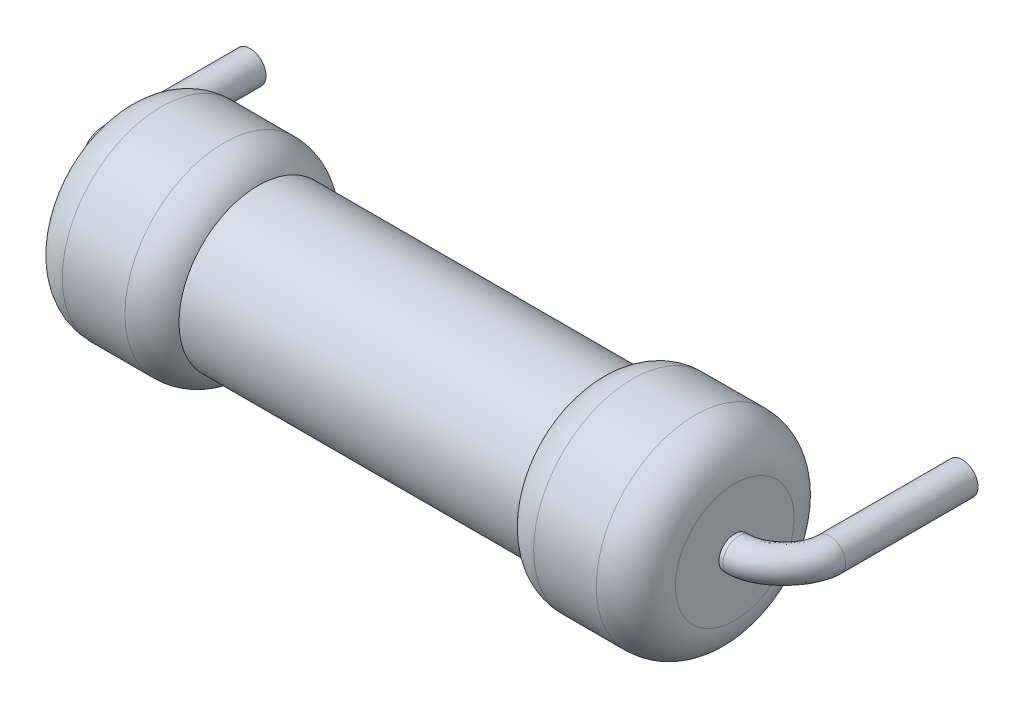
ISO-10303-21;
HEADER;
FILE_DESCRIPTION(('STEP AP214'),'2;1');
FILE_NAME('part.step','',(''),(''),'','','');
FILE_SCHEMA(('AUTOMOTIVE_DESIGN { 1 0 10303 214 1 1 1 1 }'));
ENDSEC;
DATA;
#1=APPLICATION_CONTEXT('core data for automotive mechanical design processes');
#2=APPLICATION_PROTOCOL_DEFINITION('international standard','automotive_design',2000,#1);
#3=PRODUCT_CONTEXT('',#1,'mechanical');
#4=PRODUCT('Part','Part','',(#3));
#5=PRODUCT_RELATED_PRODUCT_CATEGORY('part','',(#4));
#6=PRODUCT_DEFINITION_FORMATION('','',#4);
#7=PRODUCT_DEFINITION_CONTEXT('part definition',#1,'design');
#8=PRODUCT_DEFINITION('design','',#6,#7);
#9=PRODUCT_DEFINITION_SHAPE('','',#8);
#10=(LENGTH_UNIT() NAMED_UNIT(*) SI_UNIT(.MILLI.,.METRE.));
#11=(NAMED_UNIT(*) PLANE_ANGLE_UNIT() SI_UNIT($,.RADIAN.));
#12=(NAMED_UNIT(*) SI_UNIT($,.STERADIAN.) SOLID_ANGLE_UNIT());
#13=UNCERTAINTY_MEASURE_WITH_UNIT(LENGTH_MEASURE(1.E-05),#10,'distance_accuracy_value','');
#14=(GEOMETRIC_REPRESENTATION_CONTEXT(3) GLOBAL_UNCERTAINTY_ASSIGNED_CONTEXT((#13)) GLOBAL_UNIT_ASSIGNED_CONTEXT((#10,
#11,#12)) REPRESENTATION_CONTEXT('',''));
#15=CARTESIAN_POINT('',(0.,0.,0.));
#16=DIRECTION('',(0.,0.,1.));
#17=DIRECTION('',(1.,0.,0.));
#18=AXIS2_PLACEMENT_3D('',#15,#16,#17);
#19=CARTESIAN_POINT('',(-7.85,0.,2.));
#20=DIRECTION('',(1.,0.,0.));
#21=DIRECTION('',(0.,0.,1.));
#22=AXIS2_PLACEMENT_3D('',#19,#20,#21);
#23=CYLINDRICAL_SURFACE('',#22,0.4);
#24=CARTESIAN_POINT('',(-7.85,-0.323459007335841,2.23531738264164));
#25=CARTESIAN_POINT('',(-7.85,-0.316965247557054,2.24424347670382));
#26=CARTESIAN_POINT('',(-7.85,-0.303375207411567,2.26140053011708));
#27=CARTESIAN_POINT('',(-7.85,-0.281326856591722,2.28502794870943));
#28=CARTESIAN_POINT('',(-7.85,-0.257759486332386,2.30652444837994));
#29=CARTESIAN_POINT('',(-7.85,-0.108106775112152,2.42258138850631));
#30=CARTESIAN_POINT('',(-7.85,0.0924998776468602,2.42735916379643));
#31=CARTESIAN_POINT('',(-7.85,0.413839263885118,2.1935838117601));
#32=CARTESIAN_POINT('',(-7.85,0.45333420291158,1.94320449860183));
#33=CARTESIAN_POINT('',(-7.85,0.193583811760101,1.58616073611488));
#34=CARTESIAN_POINT('',(-7.85,-0.056795501398165,1.54666579708842));
#35=CARTESIAN_POINT('',(-7.85,-0.378134887636423,1.78044114912475));
#36=CARTESIAN_POINT('',(-7.85,-0.435340165985808,1.97277786532025));
#37=CARTESIAN_POINT('',(-7.85,-0.370984816172936,2.15088888765611));
#38=CARTESIAN_POINT('',(-7.85,-0.357786644701291,2.17992901005306));
#39=CARTESIAN_POINT('',(-7.85,-0.342093435999191,2.20817981329555));
#40=CARTESIAN_POINT('',(-7.85,-0.329952767114628,2.22639128857947));
#41=CARTESIAN_POINT('',(-7.85,-0.323459007335841,2.23531738264164));
#42=B_SPLINE_CURVE_WITH_KNOTS('',3,(#24,#25,#26,#27,#28,#29,#30,#31,#32,#33,#34,#35,#36,#37,#38,
#39,#40,#41),.UNSPECIFIED.,.T.,.F.,(4,1,1,1,1,2,2,2,1,1,1,1,4),(0.,0.0125,0.0249999999999999,
0.0375000000000001,0.05,0.25,0.5,0.75,0.95,0.9625,0.975,0.9875,1.),.UNSPECIFIED.);
#43=CARTESIAN_POINT('',(-7.85,-0.323459007335841,2.23531738264164));
#44=VERTEX_POINT('',#43);
#45=EDGE_CURVE('E12',#44,#44,#42,.F.);
#46=ORIENTED_EDGE('',*,*,#45,.T.);
#47=EDGE_LOOP('',(#46));
#48=FACE_BOUND('',#47,.T.);
#49=CARTESIAN_POINT('',(-7.75,0.,2.));
#50=DIRECTION('',(1.,0.,0.));
#51=DIRECTION('',(0.,0.,-1.));
#52=AXIS2_PLACEMENT_3D('',#49,#50,#51);
#53=CIRCLE('',#52,0.4);
#54=CARTESIAN_POINT('',(-7.75,0.,1.6));
#55=VERTEX_POINT('',#54);
#56=EDGE_CURVE('E93',#55,#55,#53,.T.);
#57=ORIENTED_EDGE('',*,*,#56,.F.);
#58=EDGE_LOOP('',(#57));
#59=FACE_BOUND('',#58,.T.);
#60=ADVANCED_FACE('F84',(#48,#59),#23,.T.);
#61=CARTESIAN_POINT('',(-7.75,0.,2.));
#62=DIRECTION('',(-1.,0.,0.));
#63=DIRECTION('',(0.,0.,-1.));
#64=AXIS2_PLACEMENT_3D('',#61,#62,#63);
#65=PLANE('',#64);
#66=ORIENTED_EDGE('',*,*,#56,.T.);
#67=EDGE_LOOP('',(#66));
#68=FACE_BOUND('',#67,.T.);
#69=ADVANCED_FACE('F122',(#68),#65,.F.);
#70=CARTESIAN_POINT('',(-9.13217940086859,-0.377529609416294,0.85));
#71=CARTESIAN_POINT('',(-9.13217940086859,-0.377529609416294,1.47946290126938));
#72=CARTESIAN_POINT('',(-8.47946290126938,-0.323459007335841,2.23531738264164));
#73=CARTESIAN_POINT('',(-7.85,-0.323459007335841,2.23531738264164));
#74=CARTESIAN_POINT('',(-9.14259761377495,-0.373882019649194,0.85));
#75=CARTESIAN_POINT('',(-9.14259761377495,-0.373882019649194,1.48400592966714));
#76=CARTESIAN_POINT('',(-8.48400592966714,-0.316965247557054,2.24424347670382));
#77=CARTESIAN_POINT('',(-7.85,-0.316965247557054,2.24424347670382));
#78=CARTESIAN_POINT('',(-9.16294190702586,-0.365809634307624,0.85));
#79=CARTESIAN_POINT('',(-9.16294190702586,-0.365809634307624,1.49289917218409));
#80=CARTESIAN_POINT('',(-8.49289917218409,-0.303375207411567,2.26140053011708));
#81=CARTESIAN_POINT('',(-7.85,-0.303375207411567,2.26140053011708));
#82=CARTESIAN_POINT('',(-9.19191860194518,-0.351501041268287,0.85));
#83=CARTESIAN_POINT('',(-9.19191860194518,-0.351501041268287,1.50531353197619));
#84=CARTESIAN_POINT('',(-8.50531353197618,-0.281326856591722,2.28502794870943));
#85=CARTESIAN_POINT('',(-7.85,-0.281326856591722,2.28502794870943));
#86=CARTESIAN_POINT('',(-9.21929220463593,-0.335124035597089,0.85));
#87=CARTESIAN_POINT('',(-9.21929220463593,-0.335124035597089,1.51686495799785));
#88=CARTESIAN_POINT('',(-8.51686495799784,-0.257759486332386,2.30652444837994));
#89=CARTESIAN_POINT('',(-7.85,-0.257759486332386,2.30652444837994));
#90=CARTESIAN_POINT('',(-9.37353518377958,-0.225241140149463,0.85));
#91=CARTESIAN_POINT('',(-9.37353518377958,-0.225241140149463,1.58080304852248));
#92=CARTESIAN_POINT('',(-8.58080304852247,-0.108106775112152,2.42258138850631));
#93=CARTESIAN_POINT('',(-7.85,-0.108106775112152,2.42258138850631));
#94=CARTESIAN_POINT('',(-9.43589104568991,-0.0345120056332151,0.85));
#95=CARTESIAN_POINT('',(-9.43589104568991,-0.0345120056332151,1.5950973445798));
#96=CARTESIAN_POINT('',(-8.59509734457979,0.0924998776468602,2.42735916379643));
#97=CARTESIAN_POINT('',(-7.85,0.0924998776468602,2.42735916379643));
#98=CARTESIAN_POINT('',(-9.30457781407428,0.34054365899585,0.85));
#99=CARTESIAN_POINT('',(-9.30457781407428,0.34054365899585,1.51227959808129));
#100=CARTESIAN_POINT('',(-8.51227959808129,0.413839263885118,2.1935838117601));
#101=CARTESIAN_POINT('',(-7.85,0.413839263885118,2.1935838117601));
#102=CARTESIAN_POINT('',(-9.07618485725867,0.450481404758313,0.85));
#103=CARTESIAN_POINT('',(-9.07618485725867,0.450481404758313,1.38773639134445));
#104=CARTESIAN_POINT('',(-8.38773639134445,0.45333420291158,1.94320449860183));
#105=CARTESIAN_POINT('',(-7.85,0.45333420291158,1.94320449860183));
#106=CARTESIAN_POINT('',(-8.65945634100415,0.304577814074276,0.85));
#107=CARTESIAN_POINT('',(-8.65945634100415,0.304577814074276,1.22526274277296));
#108=CARTESIAN_POINT('',(-8.22526274277297,0.193583811760101,1.58616073611488));
#109=CARTESIAN_POINT('',(-7.85,0.193583811760101,1.58616073611488));
#110=CARTESIAN_POINT('',(-8.54951859524169,0.0761848572586665,0.85));
#111=CARTESIAN_POINT('',(-8.54951859524169,0.0761848572586665,1.1873323009383));
#112=CARTESIAN_POINT('',(-8.18733230093831,-0.056795501398165,1.54666579708842));
#113=CARTESIAN_POINT('',(-7.85,-0.056795501398165,1.54666579708842));
#114=CARTESIAN_POINT('',(-8.68083182685732,-0.298870807370398,0.85));
#115=CARTESIAN_POINT('',(-8.68083182685732,-0.298870807370398,1.26173995856457));
#116=CARTESIAN_POINT('',(-8.26173995856458,-0.378134887636423,1.78044114912475));
#117=CARTESIAN_POINT('',(-7.85,-0.378134887636423,1.78044114912475));
#118=CARTESIAN_POINT('',(-8.84854084270008,-0.409050398370507,0.85));
#119=CARTESIAN_POINT('',(-8.84854084270008,-0.409050398370507,1.35077916799447));
#120=CARTESIAN_POINT('',(-8.35077916799447,-0.435340165985808,1.97277786532025));
#121=CARTESIAN_POINT('',(-7.85,-0.435340165985808,1.97277786532025));
#122=CARTESIAN_POINT('',(-9.03764002887707,-0.39872348623463,0.85));
#123=CARTESIAN_POINT('',(-9.03764002887707,-0.39872348623463,1.43722411128089));
#124=CARTESIAN_POINT('',(-8.43722411128089,-0.370984816172936,2.15088888765611));
#125=CARTESIAN_POINT('',(-7.85,-0.370984816172936,2.15088888765611));
#126=CARTESIAN_POINT('',(-9.0692509366116,-0.394449032910081,0.85));
#127=CARTESIAN_POINT('',(-9.0692509366116,-0.394449032910081,1.45153945578255));
#128=CARTESIAN_POINT('',(-8.45153945578254,-0.357786644701291,2.17992901005306));
#129=CARTESIAN_POINT('',(-7.85,-0.357786644701291,2.17992901005306));
#130=CARTESIAN_POINT('',(-9.10082461865606,-0.387557931012075,0.85));
#131=CARTESIAN_POINT('',(-9.10082461865606,-0.387557931012075,1.4656410017975));
#132=CARTESIAN_POINT('',(-8.4656410017975,-0.342093435999191,2.20817981329555));
#133=CARTESIAN_POINT('',(-7.85,-0.342093435999191,2.20817981329555));
#134=CARTESIAN_POINT('',(-9.12176118796223,-0.381177199183395,0.85));
#135=CARTESIAN_POINT('',(-9.12176118796223,-0.381177199183395,1.47491987287161));
#136=CARTESIAN_POINT('',(-8.47491987287161,-0.329952767114628,2.22639128857947));
#137=CARTESIAN_POINT('',(-7.85,-0.329952767114628,2.22639128857947));
#138=CARTESIAN_POINT('',(-9.13217940086859,-0.377529609416294,0.85));
#139=CARTESIAN_POINT('',(-9.13217940086859,-0.377529609416294,1.47946290126938));
#140=CARTESIAN_POINT('',(-8.47946290126938,-0.323459007335841,2.23531738264164));
#141=CARTESIAN_POINT('',(-7.85,-0.323459007335841,2.23531738264164));
#142=B_SPLINE_SURFACE_WITH_KNOTS('',3,3,((#70,#71,#72,#73),(#74,#75,#76,#77),(#78,#79,#80,#81),
(#82,#83,#84,#85),(#86,#87,#88,#89),(#90,#91,#92,#93),(#94,#95,#96,#97),(#98,#99,#100,#101),
(#102,#103,#104,#105),(#106,#107,#108,#109),(#110,#111,#112,#113),(#114,#115,#116,#117),(#118,
#119,#120,#121),(#122,#123,#124,#125),(#126,#127,#128,#129),(#130,#131,#132,#133),(#134,#135,
#136,#137),(#138,#139,#140,#141)),.UNSPECIFIED.,.T.,.F.,.F.,(4,1,1,1,1,2,2,2,1,1,1,1,4),(4,4),
(0.,0.0125,0.0249999999999999,0.0375000000000001,0.05,0.25,0.5,0.75,0.95,0.9625,0.975,0.9875,
1.),(0.,1.),.UNSPECIFIED.);
#143=CARTESIAN_POINT('',(-9.13217940086859,-0.377529609416294,0.85));
#144=CARTESIAN_POINT('',(-9.12176118796223,-0.381177199183395,0.85));
#145=CARTESIAN_POINT('',(-9.10082461865606,-0.387557931012075,0.85));
#146=CARTESIAN_POINT('',(-9.0692509366116,-0.394449032910081,0.85));
#147=CARTESIAN_POINT('',(-9.03764002887707,-0.39872348623463,0.85));
#148=CARTESIAN_POINT('',(-8.84854084270008,-0.409050398370507,0.85));
#149=CARTESIAN_POINT('',(-8.68083182685732,-0.298870807370398,0.85));
#150=CARTESIAN_POINT('',(-8.54951859524169,0.0761848572586665,0.85));
#151=CARTESIAN_POINT('',(-8.65945634100415,0.304577814074276,0.85));
#152=CARTESIAN_POINT('',(-9.07618485725867,0.450481404758313,0.85));
#153=CARTESIAN_POINT('',(-9.30457781407428,0.34054365899585,0.85));
#154=CARTESIAN_POINT('',(-9.43589104568991,-0.0345120056332151,0.85));
#155=CARTESIAN_POINT('',(-9.37353518377958,-0.225241140149463,0.85));
#156=CARTESIAN_POINT('',(-9.21929220463593,-0.335124035597089,0.85));
#157=CARTESIAN_POINT('',(-9.19191860194518,-0.351501041268287,0.85));
#158=CARTESIAN_POINT('',(-9.16294190702586,-0.365809634307624,0.85));
#159=CARTESIAN_POINT('',(-9.14259761377495,-0.373882019649194,0.85));
#160=CARTESIAN_POINT('',(-9.13217940086859,-0.377529609416294,0.85));
#161=B_SPLINE_CURVE_WITH_KNOTS('',3,(#143,#144,#145,#146,#147,#148,#149,#150,#151,#152,#153,
#154,#155,#156,#157,#158,#159,#160),.UNSPECIFIED.,.T.,.F.,(4,1,1,1,1,2,2,2,1,1,1,1,4),(0.,
0.0125,0.025,0.0375,0.05,0.25,0.5,0.75,0.95,0.9625,0.975,0.9875,1.),.UNSPECIFIED.);
#162=CARTESIAN_POINT('',(-9.13217940086859,-0.377529609416294,0.85));
#163=VERTEX_POINT('',#162);
#164=EDGE_CURVE('E102',#163,#163,#161,.F.);
#165=ORIENTED_EDGE('',*,*,#164,.F.);
#166=EDGE_LOOP('',(#165));
#167=FACE_BOUND('',#166,.T.);
#168=ORIENTED_EDGE('',*,*,#45,.F.);
#169=EDGE_LOOP('',(#168));
#170=FACE_BOUND('',#169,.T.);
#171=ADVANCED_FACE('F110',(#167,#170),#142,.F.);
#172=CARTESIAN_POINT('',(-9.,0.,-2.5));
#173=DIRECTION('',(0.,0.,1.));
#174=DIRECTION('',(-1.,0.,0.));
#175=AXIS2_PLACEMENT_3D('',#172,#173,#174);
#176=CYLINDRICAL_SURFACE('',#175,0.4);
#177=CARTESIAN_POINT('',(-9.,0.,-2.5));
#178=DIRECTION('',(0.,0.,-1.));
#179=DIRECTION('',(-1.,0.,0.));
#180=AXIS2_PLACEMENT_3D('',#177,#178,#179);
#181=CIRCLE('',#180,0.4);
#182=CARTESIAN_POINT('',(-9.4,0.,-2.5));
#183=VERTEX_POINT('',#182);
#184=EDGE_CURVE('E97',#183,#183,#181,.T.);
#185=ORIENTED_EDGE('',*,*,#184,.F.);
#186=EDGE_LOOP('',(#185));
#187=FACE_BOUND('',#186,.T.);
#188=ORIENTED_EDGE('',*,*,#164,.T.);
#189=EDGE_LOOP('',(#188));
#190=FACE_BOUND('',#189,.T.);
#191=ADVANCED_FACE('F121',(#187,#190),#176,.T.);
#192=CARTESIAN_POINT('',(-9.,0.,-2.5));
#193=DIRECTION('',(0.,0.,1.));
#194=DIRECTION('',(-1.,0.,0.));
#195=AXIS2_PLACEMENT_3D('',#192,#193,#194);
#196=PLANE('',#195);
#197=ORIENTED_EDGE('',*,*,#184,.T.);
#198=EDGE_LOOP('',(#197));
#199=FACE_BOUND('',#198,.T.);
#200=ADVANCED_FACE('F153',(#199),#196,.F.);
#201=CLOSED_SHELL('',(#60,#69,#171,#191,#200));
#202=MANIFOLD_SOLID_BREP('B2',#201);
#203=CARTESIAN_POINT('',(4.3,0.,2.));
#204=DIRECTION('',(-1.,0.,0.));
#205=DIRECTION('',(0.,0.,1.));
#206=AXIS2_PLACEMENT_3D('',#203,#204,#205);
#207=CYLINDRICAL_SURFACE('',#206,2.);
#208=CARTESIAN_POINT('',(4.3,0.,2.));
#209=DIRECTION('',(1.,0.,0.));
#210=DIRECTION('',(0.,0.,-1.));
#211=AXIS2_PLACEMENT_3D('',#208,#209,#210);
#212=CIRCLE('',#211,2.);
#213=CARTESIAN_POINT('',(4.3,0.,4.));
#214=VERTEX_POINT('',#213);
#215=EDGE_CURVE('E232',#214,#214,#212,.T.);
#216=CARTESIAN_POINT('',(-4.3,0.,2.));
#217=DIRECTION('',(1.,0.,0.));
#218=DIRECTION('',(0.,0.,-1.));
#219=AXIS2_PLACEMENT_3D('',#216,#217,#218);
#220=CIRCLE('',#219,2.);
#221=CARTESIAN_POINT('',(-4.3,0.,4.));
#222=VERTEX_POINT('',#221);
#223=EDGE_CURVE('E246',#222,#222,#220,.T.);
#224=CARTESIAN_POINT('',(4.3,0.,4.));
#225=CARTESIAN_POINT('',(4.21041666666667,0.,4.));
#226=CARTESIAN_POINT('',(4.12083333333333,0.,4.));
#227=CARTESIAN_POINT('',(3.94166666666667,0.,4.));
#228=CARTESIAN_POINT('',(3.85208333333333,0.,4.));
#229=CARTESIAN_POINT('',(3.67291666666667,0.,4.));
#230=CARTESIAN_POINT('',(3.58333333333333,0.,4.));
#231=CARTESIAN_POINT('',(3.40416666666667,0.,4.));
#232=CARTESIAN_POINT('',(3.31458333333333,0.,4.));
#233=CARTESIAN_POINT('',(3.13541666666667,0.,4.));
#234=CARTESIAN_POINT('',(3.04583333333333,0.,4.));
#235=CARTESIAN_POINT('',(2.86666666666667,0.,4.));
#236=CARTESIAN_POINT('',(2.77708333333333,0.,4.));
#237=CARTESIAN_POINT('',(2.59791666666667,0.,4.));
#238=CARTESIAN_POINT('',(2.50833333333333,0.,4.));
#239=CARTESIAN_POINT('',(2.32916666666667,0.,4.));
#240=CARTESIAN_POINT('',(2.23958333333333,0.,4.));
#241=CARTESIAN_POINT('',(2.06041666666667,0.,4.));
#242=CARTESIAN_POINT('',(1.97083333333333,0.,4.));
#243=CARTESIAN_POINT('',(1.79166666666667,0.,4.));
#244=CARTESIAN_POINT('',(1.70208333333333,0.,4.));
#245=CARTESIAN_POINT('',(1.52291666666667,0.,4.));
#246=CARTESIAN_POINT('',(1.43333333333333,0.,4.));
#247=CARTESIAN_POINT('',(1.25416666666667,0.,4.));
#248=CARTESIAN_POINT('',(1.16458333333333,0.,4.));
#249=CARTESIAN_POINT('',(0.985416666666665,0.,4.));
#250=CARTESIAN_POINT('',(0.895833333333332,0.,4.));
#251=CARTESIAN_POINT('',(0.716666666666665,0.,4.));
#252=CARTESIAN_POINT('',(0.627083333333332,0.,4.));
#253=CARTESIAN_POINT('',(0.447916666666665,0.,4.));
#254=CARTESIAN_POINT('',(0.358333333333332,0.,4.));
#255=CARTESIAN_POINT('',(0.179166666666666,0.,4.));
#256=CARTESIAN_POINT('',(0.0895833333333324,0.,4.));
#257=CARTESIAN_POINT('',(-0.0895833333333342,0.,4.));
#258=CARTESIAN_POINT('',(-0.179166666666667,0.,4.));
#259=CARTESIAN_POINT('',(-0.358333333333334,0.,4.));
#260=CARTESIAN_POINT('',(-0.447916666666667,0.,4.));
#261=CARTESIAN_POINT('',(-0.627083333333334,0.,4.));
#262=CARTESIAN_POINT('',(-0.716666666666668,0.,4.));
#263=CARTESIAN_POINT('',(-0.895833333333335,0.,4.));
#264=CARTESIAN_POINT('',(-0.985416666666668,0.,4.));
#265=CARTESIAN_POINT('',(-1.16458333333333,0.,4.));
#266=CARTESIAN_POINT('',(-1.25416666666667,0.,4.));
#267=CARTESIAN_POINT('',(-1.43333333333333,0.,4.));
#268=CARTESIAN_POINT('',(-1.52291666666667,0.,4.));
#269=CARTESIAN_POINT('',(-1.70208333333334,0.,4.));
#270=CARTESIAN_POINT('',(-1.79166666666667,0.,4.));
#271=CARTESIAN_POINT('',(-1.97083333333334,0.,4.));
#272=CARTESIAN_POINT('',(-2.06041666666667,0.,4.));
#273=CARTESIAN_POINT('',(-2.23958333333334,0.,4.));
#274=CARTESIAN_POINT('',(-2.32916666666667,0.,4.));
#275=CARTESIAN_POINT('',(-2.50833333333334,0.,4.));
#276=CARTESIAN_POINT('',(-2.59791666666667,0.,4.));
#277=CARTESIAN_POINT('',(-2.77708333333333,0.,4.));
#278=CARTESIAN_POINT('',(-2.86666666666667,0.,4.));
#279=CARTESIAN_POINT('',(-3.04583333333334,0.,4.));
#280=CARTESIAN_POINT('',(-3.13541666666667,0.,4.));
#281=CARTESIAN_POINT('',(-3.31458333333334,0.,4.));
#282=CARTESIAN_POINT('',(-3.40416666666667,0.,4.));
#283=CARTESIAN_POINT('',(-3.58333333333334,0.,4.));
#284=CARTESIAN_POINT('',(-3.67291666666667,0.,4.));
#285=CARTESIAN_POINT('',(-3.85208333333334,0.,4.));
#286=CARTESIAN_POINT('',(-3.94166666666667,0.,4.));
#287=CARTESIAN_POINT('',(-4.12083333333333,0.,4.));
#288=CARTESIAN_POINT('',(-4.21041666666667,0.,4.));
#289=CARTESIAN_POINT('',(-4.3,0.,4.));
#290=B_SPLINE_CURVE_WITH_KNOTS('',3,(#224,#225,#226,#227,#228,#229,#230,#231,#232,#233,#234,
#235,#236,#237,#238,#239,#240,#241,#242,#243,#244,#245,#246,#247,#248,#249,#250,#251,#252,#253,
#254,#255,#256,#257,#258,#259,#260,#261,#262,#263,#264,#265,#266,#267,#268,#269,#270,#271,#272,
#273,#274,#275,#276,#277,#278,#279,#280,#281,#282,#283,#284,#285,#286,#287,#288,#289),
.UNSPECIFIED.,.F.,.F.,(4,2,2,2,2,2,2,2,2,2,2,2,2,2,2,2,2,2,2,2,2,2,2,2,2,2,2,2,2,2,2,2,4),(0.,
0.268750000000001,0.537500000000001,0.806250000000001,1.075,1.34375,1.6125,1.88125,2.15,2.41875,
2.6875,2.95625,3.225,3.49375,3.7625,4.03125,4.3,4.56875,4.8375,5.10625,5.375,5.64375,5.9125,
6.18125,6.45,6.71875,6.9875,7.25625,7.525,7.79375,8.0625,8.33125,8.6),.UNSPECIFIED.);
#291=EDGE_CURVE('BSEAM217',#214,#222,#290,.T.);
#292=ORIENTED_EDGE('',*,*,#215,.F.);
#293=ORIENTED_EDGE('',*,*,#223,.T.);
#294=ORIENTED_EDGE('',*,*,#291,.T.);
#295=ORIENTED_EDGE('',*,*,#291,.F.);
#296=EDGE_LOOP('',(#292,#294,#293,#295));
#297=FACE_BOUND('',#296,.T.);
#298=ADVANCED_FACE('F217',(#297),#207,.T.);
#299=CARTESIAN_POINT('',(22.5710678118655,0.,2.));
#300=DIRECTION('',(-1.,0.,0.));
#301=DIRECTION('',(0.,0.,1.));
#302=AXIS2_PLACEMENT_3D('',#299,#300,#301);
#303=CYLINDRICAL_SURFACE('',#302,2.5);
#304=CARTESIAN_POINT('',(6.75,0.,2.));
#305=DIRECTION('',(1.,0.,0.));
#306=DIRECTION('',(0.,0.,-1.));
#307=AXIS2_PLACEMENT_3D('',#304,#305,#306);
#308=CIRCLE('',#307,2.5);
#309=CARTESIAN_POINT('',(6.75,0.,-0.5));
#310=VERTEX_POINT('',#309);
#311=EDGE_CURVE('E83',#310,#310,#308,.F.);
#312=ORIENTED_EDGE('',*,*,#311,.T.);
#313=EDGE_LOOP('',(#312));
#314=FACE_BOUND('',#313,.T.);
#315=CARTESIAN_POINT('',(5.16602540378444,0.,2.));
#316=DIRECTION('',(-1.,0.,0.));
#317=DIRECTION('',(0.,0.,1.));
#318=AXIS2_PLACEMENT_3D('',#315,#316,#317);
#319=CIRCLE('',#318,2.5);
#320=CARTESIAN_POINT('',(5.16602540378444,0.,4.5));
#321=VERTEX_POINT('',#320);
#322=EDGE_CURVE('E224',#321,#321,#319,.F.);
#323=ORIENTED_EDGE('',*,*,#322,.T.);
#324=EDGE_LOOP('',(#323));
#325=FACE_BOUND('',#324,.T.);
#326=ADVANCED_FACE('F273',(#314,#325),#303,.T.);
#327=CARTESIAN_POINT('',(7.75,0.,2.));
#328=DIRECTION('',(1.,0.,0.));
#329=DIRECTION('',(0.,0.,-1.));
#330=AXIS2_PLACEMENT_3D('',#327,#328,#329);
#331=PLANE('',#330);
#332=CARTESIAN_POINT('',(7.75,0.,2.));
#333=DIRECTION('',(1.,0.,0.));
#334=DIRECTION('',(0.,0.,-1.));
#335=AXIS2_PLACEMENT_3D('',#332,#333,#334);
#336=CIRCLE('',#335,1.5);
#337=CARTESIAN_POINT('',(7.75,0.,0.5));
#338=VERTEX_POINT('',#337);
#339=EDGE_CURVE('E228',#338,#338,#336,.T.);
#340=ORIENTED_EDGE('',*,*,#339,.T.);
#341=EDGE_LOOP('',(#340));
#342=FACE_BOUND('',#341,.T.);
#343=ADVANCED_FACE('F280',(#342),#331,.T.);
#344=CARTESIAN_POINT('',(6.75,0.,2.));
#345=DIRECTION('',(1.,0.,0.));
#346=DIRECTION('',(0.,0.,-1.));
#347=AXIS2_PLACEMENT_3D('',#344,#345,#346);
#348=TOROIDAL_SURFACE('',#347,1.5,1.);
#349=ORIENTED_EDGE('',*,*,#311,.F.);
#350=EDGE_LOOP('',(#349));
#351=FACE_BOUND('',#350,.T.);
#352=ORIENTED_EDGE('',*,*,#339,.F.);
#353=EDGE_LOOP('',(#352));
#354=FACE_BOUND('',#353,.T.);
#355=ADVANCED_FACE('F270',(#351,#354),#348,.T.);
#356=CARTESIAN_POINT('',(5.16602540378444,0.,2.));
#357=DIRECTION('',(-1.,0.,0.));
#358=DIRECTION('',(0.,0.,1.));
#359=AXIS2_PLACEMENT_3D('',#356,#357,#358);
#360=TOROIDAL_SURFACE('',#359,1.5,1.);
#361=ORIENTED_EDGE('',*,*,#215,.T.);
#362=EDGE_LOOP('',(#361));
#363=FACE_BOUND('',#362,.T.);
#364=ORIENTED_EDGE('',*,*,#322,.F.);
#365=EDGE_LOOP('',(#364));
#366=FACE_BOUND('',#365,.T.);
#367=ADVANCED_FACE('F219',(#363,#366),#360,.T.);
#368=CARTESIAN_POINT('',(-22.5710678118655,0.,2.));
#369=DIRECTION('',(1.,0.,0.));
#370=DIRECTION('',(0.,0.,1.));
#371=AXIS2_PLACEMENT_3D('',#368,#369,#370);
#372=CYLINDRICAL_SURFACE('',#371,2.5);
#373=CARTESIAN_POINT('',(-6.75,0.,2.));
#374=DIRECTION('',(1.,0.,0.));
#375=DIRECTION('',(0.,0.,-1.));
#376=AXIS2_PLACEMENT_3D('',#373,#374,#375);
#377=CIRCLE('',#376,2.5);
#378=CARTESIAN_POINT('',(-6.75,0.,-0.5));
#379=VERTEX_POINT('',#378);
#380=EDGE_CURVE('E237',#379,#379,#377,.F.);
#381=ORIENTED_EDGE('',*,*,#380,.F.);
#382=EDGE_LOOP('',(#381));
#383=FACE_BOUND('',#382,.T.);
#384=CARTESIAN_POINT('',(-5.16602540378444,0.,2.));
#385=DIRECTION('',(-1.,0.,0.));
#386=DIRECTION('',(0.,0.,1.));
#387=AXIS2_PLACEMENT_3D('',#384,#385,#386);
#388=CIRCLE('',#387,2.5);
#389=CARTESIAN_POINT('',(-5.16602540378444,0.,4.5));
#390=VERTEX_POINT('',#389);
#391=EDGE_CURVE('E240',#390,#390,#388,.F.);
#392=ORIENTED_EDGE('',*,*,#391,.F.);
#393=EDGE_LOOP('',(#392));
#394=FACE_BOUND('',#393,.T.);
#395=ADVANCED_FACE('F258',(#383,#394),#372,.T.);
#396=CARTESIAN_POINT('',(-7.75,0.,2.));
#397=DIRECTION('',(-1.,0.,0.));
#398=DIRECTION('',(0.,0.,-1.));
#399=AXIS2_PLACEMENT_3D('',#396,#397,#398);
#400=PLANE('',#399);
#401=CARTESIAN_POINT('',(-7.75,0.,2.));
#402=DIRECTION('',(1.,0.,0.));
#403=DIRECTION('',(0.,0.,-1.));
#404=AXIS2_PLACEMENT_3D('',#401,#402,#403);
#405=CIRCLE('',#404,1.5);
#406=CARTESIAN_POINT('',(-7.75,0.,0.5));
#407=VERTEX_POINT('',#406);
#408=EDGE_CURVE('E243',#407,#407,#405,.T.);
#409=ORIENTED_EDGE('',*,*,#408,.F.);
#410=EDGE_LOOP('',(#409));
#411=FACE_BOUND('',#410,.T.);
#412=ADVANCED_FACE('F260',(#411),#400,.T.);
#413=CARTESIAN_POINT('',(-6.75,0.,2.));
#414=DIRECTION('',(-1.,0.,0.));
#415=DIRECTION('',(0.,0.,-1.));
#416=AXIS2_PLACEMENT_3D('',#413,#414,#415);
#417=TOROIDAL_SURFACE('',#416,1.5,1.);
#418=ORIENTED_EDGE('',*,*,#380,.T.);
#419=EDGE_LOOP('',(#418));
#420=FACE_BOUND('',#419,.T.);
#421=ORIENTED_EDGE('',*,*,#408,.T.);
#422=EDGE_LOOP('',(#421));
#423=FACE_BOUND('',#422,.T.);
#424=ADVANCED_FACE('F254',(#420,#423),#417,.T.);
#425=CARTESIAN_POINT('',(-5.16602540378444,0.,2.));
#426=DIRECTION('',(1.,0.,0.));
#427=DIRECTION('',(0.,0.,1.));
#428=AXIS2_PLACEMENT_3D('',#425,#426,#427);
#429=TOROIDAL_SURFACE('',#428,1.5,1.);
#430=ORIENTED_EDGE('',*,*,#223,.F.);
#431=EDGE_LOOP('',(#430));
#432=FACE_BOUND('',#431,.T.);
#433=ORIENTED_EDGE('',*,*,#391,.T.);
#434=EDGE_LOOP('',(#433));
#435=FACE_BOUND('',#434,.T.);
#436=ADVANCED_FACE('F251',(#432,#435),#429,.T.);
#437=CLOSED_SHELL('',(#298,#326,#343,#355,#367,#395,#412,#424,#436));
#438=MANIFOLD_SOLID_BREP('B7',#437);
#439=CARTESIAN_POINT('',(7.85,0.,2.));
#440=DIRECTION('',(-1.,0.,0.));
#441=DIRECTION('',(0.,0.,1.));
#442=AXIS2_PLACEMENT_3D('',#439,#440,#441);
#443=CYLINDRICAL_SURFACE('',#442,0.4);
#444=CARTESIAN_POINT('',(7.85,-0.323459007335841,2.23531738264164));
#445=CARTESIAN_POINT('',(7.85,-0.329952767114628,2.22639128857947));
#446=CARTESIAN_POINT('',(7.85,-0.342093435999191,2.20817981329555));
#447=CARTESIAN_POINT('',(7.85,-0.357786644701291,2.17992901005306));
#448=CARTESIAN_POINT('',(7.85,-0.370984816172936,2.15088888765611));
#449=CARTESIAN_POINT('',(7.85,-0.435340165985808,1.97277786532025));
#450=CARTESIAN_POINT('',(7.85,-0.378134887636423,1.78044114912475));
#451=CARTESIAN_POINT('',(7.85,-0.056795501398165,1.54666579708842));
#452=CARTESIAN_POINT('',(7.85,0.193583811760101,1.58616073611488));
#453=CARTESIAN_POINT('',(7.85,0.45333420291158,1.94320449860183));
#454=CARTESIAN_POINT('',(7.85,0.413839263885118,2.1935838117601));
#455=CARTESIAN_POINT('',(7.85,0.0924998776468602,2.42735916379643));
#456=CARTESIAN_POINT('',(7.85,-0.108106775112152,2.42258138850631));
#457=CARTESIAN_POINT('',(7.85,-0.257759486332386,2.30652444837994));
#458=CARTESIAN_POINT('',(7.85,-0.281326856591722,2.28502794870943));
#459=CARTESIAN_POINT('',(7.85,-0.303375207411567,2.26140053011708));
#460=CARTESIAN_POINT('',(7.85,-0.316965247557054,2.24424347670382));
#461=CARTESIAN_POINT('',(7.85,-0.323459007335841,2.23531738264164));
#462=B_SPLINE_CURVE_WITH_KNOTS('',3,(#444,#445,#446,#447,#448,#449,#450,#451,#452,#453,#454,
#455,#456,#457,#458,#459,#460,#461),.UNSPECIFIED.,.T.,.F.,(4,1,1,1,1,2,2,2,1,1,1,1,4),(0.,
0.0125,0.025,0.0375,0.05,0.25,0.5,0.75,0.95,0.9625,0.975,0.9875,1.),.UNSPECIFIED.);
#463=CARTESIAN_POINT('',(7.85,-0.323459007335841,2.23531738264164));
#464=VERTEX_POINT('',#463);
#465=EDGE_CURVE('E216',#464,#464,#462,.T.);
#466=ORIENTED_EDGE('',*,*,#465,.F.);
#467=EDGE_LOOP('',(#466));
#468=FACE_BOUND('',#467,.T.);
#469=CARTESIAN_POINT('',(7.75,0.,2.));
#470=DIRECTION('',(1.,0.,0.));
#471=DIRECTION('',(0.,0.,-1.));
#472=AXIS2_PLACEMENT_3D('',#469,#470,#471);
#473=CIRCLE('',#472,0.4);
#474=CARTESIAN_POINT('',(7.75,0.,1.6));
#475=VERTEX_POINT('',#474);
#476=EDGE_CURVE('E359',#475,#475,#473,.T.);
#477=ORIENTED_EDGE('',*,*,#476,.T.);
#478=EDGE_LOOP('',(#477));
#479=FACE_BOUND('',#478,.T.);
#480=ADVANCED_FACE('F350',(#468,#479),#443,.T.);
#481=CARTESIAN_POINT('',(7.75,0.,2.));
#482=DIRECTION('',(1.,0.,0.));
#483=DIRECTION('',(0.,0.,-1.));
#484=AXIS2_PLACEMENT_3D('',#481,#482,#483);
#485=PLANE('',#484);
#486=ORIENTED_EDGE('',*,*,#476,.F.);
#487=EDGE_LOOP('',(#486));
#488=FACE_BOUND('',#487,.T.);
#489=ADVANCED_FACE('F377',(#488),#485,.F.);
#490=CARTESIAN_POINT('',(9.13217940086859,-0.377529609416294,0.85));
#491=CARTESIAN_POINT('',(9.13217940086859,-0.377529609416294,1.47946290126938));
#492=CARTESIAN_POINT('',(8.47946290126938,-0.323459007335841,2.23531738264164));
#493=CARTESIAN_POINT('',(7.85,-0.323459007335841,2.23531738264164));
#494=CARTESIAN_POINT('',(9.14259761377495,-0.373882019649194,0.85));
#495=CARTESIAN_POINT('',(9.14259761377495,-0.373882019649194,1.48400592966714));
#496=CARTESIAN_POINT('',(8.48400592966714,-0.316965247557054,2.24424347670382));
#497=CARTESIAN_POINT('',(7.85,-0.316965247557054,2.24424347670382));
#498=CARTESIAN_POINT('',(9.16294190702586,-0.365809634307624,0.85));
#499=CARTESIAN_POINT('',(9.16294190702586,-0.365809634307624,1.49289917218409));
#500=CARTESIAN_POINT('',(8.49289917218409,-0.303375207411567,2.26140053011708));
#501=CARTESIAN_POINT('',(7.85,-0.303375207411567,2.26140053011708));
#502=CARTESIAN_POINT('',(9.19191860194518,-0.351501041268287,0.85));
#503=CARTESIAN_POINT('',(9.19191860194518,-0.351501041268287,1.50531353197619));
#504=CARTESIAN_POINT('',(8.50531353197618,-0.281326856591722,2.28502794870943));
#505=CARTESIAN_POINT('',(7.85,-0.281326856591722,2.28502794870943));
#506=CARTESIAN_POINT('',(9.21929220463593,-0.335124035597089,0.85));
#507=CARTESIAN_POINT('',(9.21929220463593,-0.335124035597089,1.51686495799785));
#508=CARTESIAN_POINT('',(8.51686495799784,-0.257759486332386,2.30652444837994));
#509=CARTESIAN_POINT('',(7.85,-0.257759486332386,2.30652444837994));
#510=CARTESIAN_POINT('',(9.37353518377958,-0.225241140149463,0.85));
#511=CARTESIAN_POINT('',(9.37353518377958,-0.225241140149463,1.58080304852248));
#512=CARTESIAN_POINT('',(8.58080304852247,-0.108106775112152,2.42258138850631));
#513=CARTESIAN_POINT('',(7.85,-0.108106775112152,2.42258138850631));
#514=CARTESIAN_POINT('',(9.43589104568991,-0.0345120056332151,0.85));
#515=CARTESIAN_POINT('',(9.43589104568991,-0.0345120056332151,1.5950973445798));
#516=CARTESIAN_POINT('',(8.59509734457979,0.0924998776468602,2.42735916379643));
#517=CARTESIAN_POINT('',(7.85,0.0924998776468602,2.42735916379643));
#518=CARTESIAN_POINT('',(9.30457781407428,0.34054365899585,0.85));
#519=CARTESIAN_POINT('',(9.30457781407428,0.34054365899585,1.51227959808129));
#520=CARTESIAN_POINT('',(8.51227959808129,0.413839263885118,2.1935838117601));
#521=CARTESIAN_POINT('',(7.85,0.413839263885118,2.1935838117601));
#522=CARTESIAN_POINT('',(9.07618485725867,0.450481404758313,0.85));
#523=CARTESIAN_POINT('',(9.07618485725867,0.450481404758313,1.38773639134445));
#524=CARTESIAN_POINT('',(8.38773639134445,0.45333420291158,1.94320449860183));
#525=CARTESIAN_POINT('',(7.85,0.45333420291158,1.94320449860183));
#526=CARTESIAN_POINT('',(8.65945634100415,0.304577814074276,0.85));
#527=CARTESIAN_POINT('',(8.65945634100415,0.304577814074276,1.22526274277296));
#528=CARTESIAN_POINT('',(8.22526274277297,0.193583811760101,1.58616073611488));
#529=CARTESIAN_POINT('',(7.85,0.193583811760101,1.58616073611488));
#530=CARTESIAN_POINT('',(8.54951859524169,0.0761848572586665,0.85));
#531=CARTESIAN_POINT('',(8.54951859524169,0.0761848572586665,1.1873323009383));
#532=CARTESIAN_POINT('',(8.18733230093831,-0.056795501398165,1.54666579708842));
#533=CARTESIAN_POINT('',(7.85,-0.056795501398165,1.54666579708842));
#534=CARTESIAN_POINT('',(8.68083182685732,-0.298870807370398,0.85));
#535=CARTESIAN_POINT('',(8.68083182685732,-0.298870807370398,1.26173995856457));
#536=CARTESIAN_POINT('',(8.26173995856458,-0.378134887636423,1.78044114912475));
#537=CARTESIAN_POINT('',(7.85,-0.378134887636423,1.78044114912475));
#538=CARTESIAN_POINT('',(8.84854084270008,-0.409050398370507,0.85));
#539=CARTESIAN_POINT('',(8.84854084270008,-0.409050398370507,1.35077916799447));
#540=CARTESIAN_POINT('',(8.35077916799447,-0.435340165985808,1.97277786532025));
#541=CARTESIAN_POINT('',(7.85,-0.435340165985808,1.97277786532025));
#542=CARTESIAN_POINT('',(9.03764002887707,-0.39872348623463,0.85));
#543=CARTESIAN_POINT('',(9.03764002887707,-0.39872348623463,1.43722411128089));
#544=CARTESIAN_POINT('',(8.43722411128089,-0.370984816172936,2.15088888765611));
#545=CARTESIAN_POINT('',(7.85,-0.370984816172936,2.15088888765611));
#546=CARTESIAN_POINT('',(9.0692509366116,-0.394449032910081,0.85));
#547=CARTESIAN_POINT('',(9.0692509366116,-0.394449032910081,1.45153945578255));
#548=CARTESIAN_POINT('',(8.45153945578254,-0.357786644701291,2.17992901005306));
#549=CARTESIAN_POINT('',(7.85,-0.357786644701291,2.17992901005306));
#550=CARTESIAN_POINT('',(9.10082461865606,-0.387557931012075,0.85));
#551=CARTESIAN_POINT('',(9.10082461865606,-0.387557931012075,1.4656410017975));
#552=CARTESIAN_POINT('',(8.4656410017975,-0.342093435999191,2.20817981329555));
#553=CARTESIAN_POINT('',(7.85,-0.342093435999191,2.20817981329555));
#554=CARTESIAN_POINT('',(9.12176118796223,-0.381177199183395,0.85));
#555=CARTESIAN_POINT('',(9.12176118796223,-0.381177199183395,1.47491987287161));
#556=CARTESIAN_POINT('',(8.47491987287161,-0.329952767114628,2.22639128857947));
#557=CARTESIAN_POINT('',(7.85,-0.329952767114628,2.22639128857947));
#558=CARTESIAN_POINT('',(9.13217940086859,-0.377529609416294,0.85));
#559=CARTESIAN_POINT('',(9.13217940086859,-0.377529609416294,1.47946290126938));
#560=CARTESIAN_POINT('',(8.47946290126938,-0.323459007335841,2.23531738264164));
#561=CARTESIAN_POINT('',(7.85,-0.323459007335841,2.23531738264164));
#562=B_SPLINE_SURFACE_WITH_KNOTS('',3,3,((#490,#491,#492,#493),(#494,#495,#496,#497),(#498,#499,
#500,#501),(#502,#503,#504,#505),(#506,#507,#508,#509),(#510,#511,#512,#513),(#514,#515,#516,
#517),(#518,#519,#520,#521),(#522,#523,#524,#525),(#526,#527,#528,#529),(#530,#531,#532,#533),
(#534,#535,#536,#537),(#538,#539,#540,#541),(#542,#543,#544,#545),(#546,#547,#548,#549),(#550,
#551,#552,#553),(#554,#555,#556,#557),(#558,#559,#560,#561)),.UNSPECIFIED.,.T.,.F.,.F.,(4,1,1,1,
1,2,2,2,1,1,1,1,4),(4,4),(0.,0.0125,0.0249999999999999,0.0375000000000001,0.05,0.25,0.5,0.75,
0.95,0.9625,0.975,0.9875,1.),(0.,1.),.UNSPECIFIED.);
#563=CARTESIAN_POINT('',(9.13217940086859,-0.377529609416294,0.85));
#564=CARTESIAN_POINT('',(9.14259761377495,-0.373882019649194,0.85));
#565=CARTESIAN_POINT('',(9.16294190702586,-0.365809634307624,0.85));
#566=CARTESIAN_POINT('',(9.19191860194518,-0.351501041268287,0.85));
#567=CARTESIAN_POINT('',(9.21929220463593,-0.335124035597089,0.85));
#568=CARTESIAN_POINT('',(9.37353518377958,-0.225241140149463,0.85));
#569=CARTESIAN_POINT('',(9.43589104568991,-0.0345120056332151,0.85));
#570=CARTESIAN_POINT('',(9.30457781407428,0.34054365899585,0.85));
#571=CARTESIAN_POINT('',(9.07618485725867,0.450481404758313,0.85));
#572=CARTESIAN_POINT('',(8.65945634100415,0.304577814074276,0.85));
#573=CARTESIAN_POINT('',(8.54951859524169,0.0761848572586665,0.85));
#574=CARTESIAN_POINT('',(8.68083182685732,-0.298870807370398,0.85));
#575=CARTESIAN_POINT('',(8.84854084270008,-0.409050398370507,0.85));
#576=CARTESIAN_POINT('',(9.03764002887707,-0.39872348623463,0.85));
#577=CARTESIAN_POINT('',(9.0692509366116,-0.394449032910081,0.85));
#578=CARTESIAN_POINT('',(9.10082461865606,-0.387557931012075,0.85));
#579=CARTESIAN_POINT('',(9.12176118796223,-0.381177199183395,0.85));
#580=CARTESIAN_POINT('',(9.13217940086859,-0.377529609416294,0.85));
#581=B_SPLINE_CURVE_WITH_KNOTS('',3,(#563,#564,#565,#566,#567,#568,#569,#570,#571,#572,#573,
#574,#575,#576,#577,#578,#579,#580),.UNSPECIFIED.,.T.,.F.,(4,1,1,1,1,2,2,2,1,1,1,1,4),(0.,
0.0125,0.0249999999999999,0.0375000000000001,0.05,0.25,0.5,0.75,0.95,0.9625,0.975,0.9875,1.),.UNSPECIFIED.);
#582=CARTESIAN_POINT('',(9.13217940086859,-0.377529609416294,0.85));
#583=VERTEX_POINT('',#582);
#584=EDGE_CURVE('E369',#583,#583,#581,.T.);
#585=ORIENTED_EDGE('',*,*,#584,.T.);
#586=EDGE_LOOP('',(#585));
#587=FACE_BOUND('',#586,.T.);
#588=ORIENTED_EDGE('',*,*,#465,.T.);
#589=EDGE_LOOP('',(#588));
#590=FACE_BOUND('',#589,.T.);
#591=ADVANCED_FACE('F381',(#587,#590),#562,.T.);
#592=CARTESIAN_POINT('',(9.,0.,-2.5));
#593=DIRECTION('',(0.,0.,1.));
#594=DIRECTION('',(1.,0.,0.));
#595=AXIS2_PLACEMENT_3D('',#592,#593,#594);
#596=CYLINDRICAL_SURFACE('',#595,0.4);
#597=CARTESIAN_POINT('',(9.,0.,-2.5));
#598=DIRECTION('',(0.,0.,1.));
#599=DIRECTION('',(1.,0.,0.));
#600=AXIS2_PLACEMENT_3D('',#597,#598,#599);
#601=CIRCLE('',#600,0.4);
#602=CARTESIAN_POINT('',(9.4,0.,-2.5));
#603=VERTEX_POINT('',#602);
#604=EDGE_CURVE('E364',#603,#603,#601,.T.);
#605=ORIENTED_EDGE('',*,*,#604,.T.);
#606=EDGE_LOOP('',(#605));
#607=FACE_BOUND('',#606,.T.);
#608=ORIENTED_EDGE('',*,*,#584,.F.);
#609=EDGE_LOOP('',(#608));
#610=FACE_BOUND('',#609,.T.);
#611=ADVANCED_FACE('F386',(#607,#610),#596,.T.);
#612=CARTESIAN_POINT('',(9.,0.,-2.5));
#613=DIRECTION('',(0.,0.,1.));
#614=DIRECTION('',(1.,0.,0.));
#615=AXIS2_PLACEMENT_3D('',#612,#613,#614);
#616=PLANE('',#615);
#617=ORIENTED_EDGE('',*,*,#604,.F.);
#618=EDGE_LOOP('',(#617));
#619=FACE_BOUND('',#618,.T.);
#620=ADVANCED_FACE('F422',(#619),#616,.F.);
#621=CLOSED_SHELL('',(#480,#489,#591,#611,#620));
#622=MANIFOLD_SOLID_BREP('B78',#621);
#623=ADVANCED_BREP_SHAPE_REPRESENTATION('',(#18,#202,#438,#622),#14);
#624=SHAPE_DEFINITION_REPRESENTATION(#9,#623);
ENDSEC;
END-ISO-10303-21;
